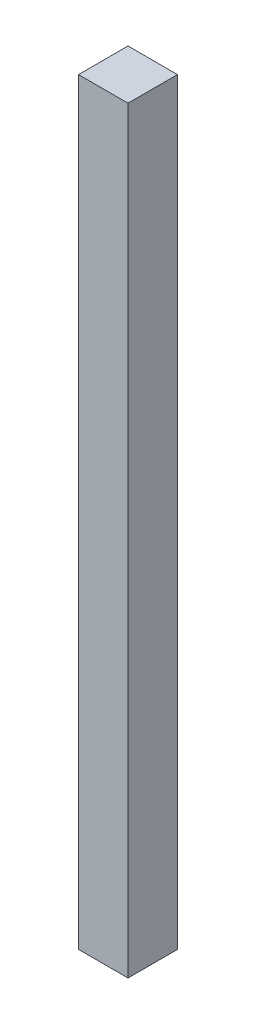
ISO-10303-21;
HEADER;
FILE_DESCRIPTION(('STEP AP214'),'2;1');
FILE_NAME('part.step','',(''),(''),'','','');
FILE_SCHEMA(('AUTOMOTIVE_DESIGN { 1 0 10303 214 1 1 1 1 }'));
ENDSEC;
DATA;
#1=APPLICATION_CONTEXT('core data for automotive mechanical design processes');
#2=APPLICATION_PROTOCOL_DEFINITION('international standard','automotive_design',2000,#1);
#3=PRODUCT_CONTEXT('',#1,'mechanical');
#4=PRODUCT('Part','Part','',(#3));
#5=PRODUCT_RELATED_PRODUCT_CATEGORY('part','',(#4));
#6=PRODUCT_DEFINITION_FORMATION('','',#4);
#7=PRODUCT_DEFINITION_CONTEXT('part definition',#1,'design');
#8=PRODUCT_DEFINITION('design','',#6,#7);
#9=PRODUCT_DEFINITION_SHAPE('','',#8);
#10=(LENGTH_UNIT() NAMED_UNIT(*) SI_UNIT(.MILLI.,.METRE.));
#11=(NAMED_UNIT(*) PLANE_ANGLE_UNIT() SI_UNIT($,.RADIAN.));
#12=(NAMED_UNIT(*) SI_UNIT($,.STERADIAN.) SOLID_ANGLE_UNIT());
#13=UNCERTAINTY_MEASURE_WITH_UNIT(LENGTH_MEASURE(1.E-05),#10,'distance_accuracy_value','');
#14=(GEOMETRIC_REPRESENTATION_CONTEXT(3) GLOBAL_UNCERTAINTY_ASSIGNED_CONTEXT((#13)) GLOBAL_UNIT_ASSIGNED_CONTEXT((#10,
#11,#12)) REPRESENTATION_CONTEXT('',''));
#15=CARTESIAN_POINT('',(0.,0.,0.));
#16=DIRECTION('',(0.,0.,1.));
#17=DIRECTION('',(1.,0.,0.));
#18=AXIS2_PLACEMENT_3D('',#15,#16,#17);
#19=CARTESIAN_POINT('',(0.,306.,0.));
#20=DIRECTION('',(1.,0.,0.));
#21=DIRECTION('',(0.,0.,-1.));
#22=AXIS2_PLACEMENT_3D('',#19,#20,#21);
#23=PLANE('',#22);
#24=DIRECTION('',(0.,0.,1.));
#25=VECTOR('',#24,1.);
#26=CARTESIAN_POINT('',(0.,0.,0.));
#27=LINE('',#26,#25);
#28=CARTESIAN_POINT('',(0.,0.,-20.));
#29=VERTEX_POINT('',#28);
#30=CARTESIAN_POINT('',(0.,0.,0.));
#31=VERTEX_POINT('',#30);
#32=EDGE_CURVE('E102',#29,#31,#27,.T.);
#33=ORIENTED_EDGE('',*,*,#32,.T.);
#34=DIRECTION('',(0.,-1.,0.));
#35=VECTOR('',#34,1.);
#36=CARTESIAN_POINT('',(0.,306.,0.));
#37=LINE('',#36,#35);
#38=CARTESIAN_POINT('',(0.,306.,0.));
#39=VERTEX_POINT('',#38);
#40=EDGE_CURVE('E11',#39,#31,#37,.T.);
#41=ORIENTED_EDGE('',*,*,#40,.F.);
#42=DIRECTION('',(0.,0.,1.));
#43=VECTOR('',#42,1.);
#44=CARTESIAN_POINT('',(0.,306.,0.));
#45=LINE('',#44,#43);
#46=CARTESIAN_POINT('',(0.,306.,-20.));
#47=VERTEX_POINT('',#46);
#48=EDGE_CURVE('E90',#47,#39,#45,.T.);
#49=ORIENTED_EDGE('',*,*,#48,.F.);
#50=DIRECTION('',(0.,-1.,0.));
#51=VECTOR('',#50,1.);
#52=CARTESIAN_POINT('',(0.,306.,-20.));
#53=LINE('',#52,#51);
#54=EDGE_CURVE('E98',#47,#29,#53,.T.);
#55=ORIENTED_EDGE('',*,*,#54,.T.);
#56=EDGE_LOOP('',(#33,#41,#49,#55));
#57=FACE_BOUND('',#56,.T.);
#58=ADVANCED_FACE('F39',(#57),#23,.F.);
#59=CARTESIAN_POINT('',(0.,306.,0.));
#60=DIRECTION('',(0.,0.,-1.));
#61=DIRECTION('',(-1.,0.,0.));
#62=AXIS2_PLACEMENT_3D('',#59,#60,#61);
#63=PLANE('',#62);
#64=DIRECTION('',(1.,0.,0.));
#65=VECTOR('',#64,1.);
#66=CARTESIAN_POINT('',(0.,0.,0.));
#67=LINE('',#66,#65);
#68=CARTESIAN_POINT('',(20.,0.,0.));
#69=VERTEX_POINT('',#68);
#70=EDGE_CURVE('E94',#31,#69,#67,.T.);
#71=ORIENTED_EDGE('',*,*,#70,.T.);
#72=DIRECTION('',(0.,-1.,0.));
#73=VECTOR('',#72,1.);
#74=CARTESIAN_POINT('',(20.,306.,0.));
#75=LINE('',#74,#73);
#76=CARTESIAN_POINT('',(20.,306.,0.));
#77=VERTEX_POINT('',#76);
#78=EDGE_CURVE('E47',#77,#69,#75,.T.);
#79=ORIENTED_EDGE('',*,*,#78,.F.);
#80=DIRECTION('',(1.,0.,0.));
#81=VECTOR('',#80,1.);
#82=CARTESIAN_POINT('',(0.,306.,0.));
#83=LINE('',#82,#81);
#84=EDGE_CURVE('E85',#39,#77,#83,.T.);
#85=ORIENTED_EDGE('',*,*,#84,.F.);
#86=ORIENTED_EDGE('',*,*,#40,.T.);
#87=EDGE_LOOP('',(#71,#79,#85,#86));
#88=FACE_BOUND('',#87,.T.);
#89=ADVANCED_FACE('F93',(#88),#63,.F.);
#90=CARTESIAN_POINT('',(20.,306.,0.));
#91=DIRECTION('',(-1.,0.,0.));
#92=DIRECTION('',(0.,0.,1.));
#93=AXIS2_PLACEMENT_3D('',#90,#91,#92);
#94=PLANE('',#93);
#95=DIRECTION('',(0.,0.,-1.));
#96=VECTOR('',#95,1.);
#97=CARTESIAN_POINT('',(20.,0.,0.));
#98=LINE('',#97,#96);
#99=CARTESIAN_POINT('',(20.,0.,-20.));
#100=VERTEX_POINT('',#99);
#101=EDGE_CURVE('E72',#69,#100,#98,.T.);
#102=ORIENTED_EDGE('',*,*,#101,.T.);
#103=DIRECTION('',(0.,-1.,0.));
#104=VECTOR('',#103,1.);
#105=CARTESIAN_POINT('',(20.,306.,-20.));
#106=LINE('',#105,#104);
#107=CARTESIAN_POINT('',(20.,306.,-20.));
#108=VERTEX_POINT('',#107);
#109=EDGE_CURVE('E95',#108,#100,#106,.T.);
#110=ORIENTED_EDGE('',*,*,#109,.F.);
#111=DIRECTION('',(0.,0.,-1.));
#112=VECTOR('',#111,1.);
#113=CARTESIAN_POINT('',(20.,306.,0.));
#114=LINE('',#113,#112);
#115=EDGE_CURVE('E88',#77,#108,#114,.T.);
#116=ORIENTED_EDGE('',*,*,#115,.F.);
#117=ORIENTED_EDGE('',*,*,#78,.T.);
#118=EDGE_LOOP('',(#102,#110,#116,#117));
#119=FACE_BOUND('',#118,.T.);
#120=ADVANCED_FACE('F96',(#119),#94,.F.);
#121=CARTESIAN_POINT('',(0.,306.,-20.));
#122=DIRECTION('',(0.,0.,1.));
#123=DIRECTION('',(1.,0.,0.));
#124=AXIS2_PLACEMENT_3D('',#121,#122,#123);
#125=PLANE('',#124);
#126=DIRECTION('',(-1.,0.,0.));
#127=VECTOR('',#126,1.);
#128=CARTESIAN_POINT('',(0.,0.,-20.));
#129=LINE('',#128,#127);
#130=EDGE_CURVE('E78',#100,#29,#129,.T.);
#131=ORIENTED_EDGE('',*,*,#130,.T.);
#132=ORIENTED_EDGE('',*,*,#54,.F.);
#133=DIRECTION('',(-1.,0.,0.));
#134=VECTOR('',#133,1.);
#135=CARTESIAN_POINT('',(0.,306.,-20.));
#136=LINE('',#135,#134);
#137=EDGE_CURVE('E55',#108,#47,#136,.T.);
#138=ORIENTED_EDGE('',*,*,#137,.F.);
#139=ORIENTED_EDGE('',*,*,#109,.T.);
#140=EDGE_LOOP('',(#131,#132,#138,#139));
#141=FACE_BOUND('',#140,.T.);
#142=ADVANCED_FACE('F109',(#141),#125,.F.);
#143=CARTESIAN_POINT('',(0.,306.,0.));
#144=DIRECTION('',(0.,-1.,0.));
#145=DIRECTION('',(0.,0.,-1.));
#146=AXIS2_PLACEMENT_3D('',#143,#144,#145);
#147=PLANE('',#146);
#148=ORIENTED_EDGE('',*,*,#48,.T.);
#149=ORIENTED_EDGE('',*,*,#84,.T.);
#150=ORIENTED_EDGE('',*,*,#115,.T.);
#151=ORIENTED_EDGE('',*,*,#137,.T.);
#152=EDGE_LOOP('',(#148,#149,#150,#151));
#153=FACE_BOUND('',#152,.T.);
#154=ADVANCED_FACE('F86',(#153),#147,.F.);
#155=CARTESIAN_POINT('',(0.,0.,0.));
#156=DIRECTION('',(0.,-1.,0.));
#157=DIRECTION('',(0.,0.,-1.));
#158=AXIS2_PLACEMENT_3D('',#155,#156,#157);
#159=PLANE('',#158);
#160=ORIENTED_EDGE('',*,*,#32,.F.);
#161=ORIENTED_EDGE('',*,*,#130,.F.);
#162=ORIENTED_EDGE('',*,*,#101,.F.);
#163=ORIENTED_EDGE('',*,*,#70,.F.);
#164=EDGE_LOOP('',(#160,#161,#162,#163));
#165=FACE_BOUND('',#164,.T.);
#166=ADVANCED_FACE('F112',(#165),#159,.T.);
#167=CLOSED_SHELL('',(#58,#89,#120,#142,#154,#166));
#168=MANIFOLD_SOLID_BREP('B2',#167);
#169=ADVANCED_BREP_SHAPE_REPRESENTATION('',(#18,#168),#14);
#170=SHAPE_DEFINITION_REPRESENTATION(#9,#169);
ENDSEC;
END-ISO-10303-21;
